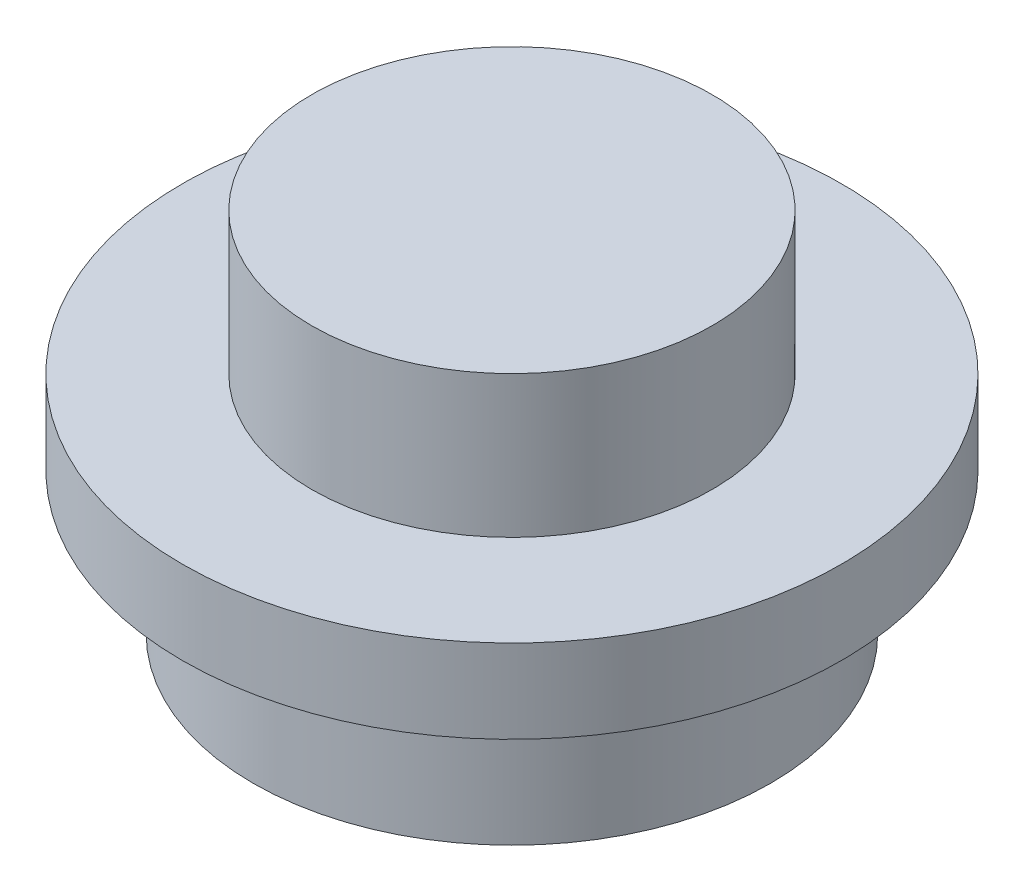
ISO-10303-21;
HEADER;
FILE_DESCRIPTION(('STEP AP214'),'2;1');
FILE_NAME('part.step','',(''),(''),'','','');
FILE_SCHEMA(('AUTOMOTIVE_DESIGN { 1 0 10303 214 1 1 1 1 }'));
ENDSEC;
DATA;
#1=APPLICATION_CONTEXT('core data for automotive mechanical design processes');
#2=APPLICATION_PROTOCOL_DEFINITION('international standard','automotive_design',2000,#1);
#3=PRODUCT_CONTEXT('',#1,'mechanical');
#4=PRODUCT('Part','Part','',(#3));
#5=PRODUCT_RELATED_PRODUCT_CATEGORY('part','',(#4));
#6=PRODUCT_DEFINITION_FORMATION('','',#4);
#7=PRODUCT_DEFINITION_CONTEXT('part definition',#1,'design');
#8=PRODUCT_DEFINITION('design','',#6,#7);
#9=PRODUCT_DEFINITION_SHAPE('','',#8);
#10=(LENGTH_UNIT() NAMED_UNIT(*) SI_UNIT(.MILLI.,.METRE.));
#11=(NAMED_UNIT(*) PLANE_ANGLE_UNIT() SI_UNIT($,.RADIAN.));
#12=(NAMED_UNIT(*) SI_UNIT($,.STERADIAN.) SOLID_ANGLE_UNIT());
#13=UNCERTAINTY_MEASURE_WITH_UNIT(LENGTH_MEASURE(1.E-05),#10,'distance_accuracy_value','');
#14=(GEOMETRIC_REPRESENTATION_CONTEXT(3) GLOBAL_UNCERTAINTY_ASSIGNED_CONTEXT((#13)) GLOBAL_UNIT_ASSIGNED_CONTEXT((#10,
#11,#12)) REPRESENTATION_CONTEXT('',''));
#15=CARTESIAN_POINT('',(0.,0.,0.));
#16=DIRECTION('',(0.,0.,1.));
#17=DIRECTION('',(1.,0.,0.));
#18=AXIS2_PLACEMENT_3D('',#15,#16,#17);
#19=CARTESIAN_POINT('',(0.,0.,0.));
#20=DIRECTION('',(0.,1.,0.));
#21=DIRECTION('',(0.,0.,1.));
#22=AXIS2_PLACEMENT_3D('',#19,#20,#21);
#23=PLANE('',#22);
#24=CARTESIAN_POINT('',(0.,0.,0.));
#25=DIRECTION('',(0.,1.,0.));
#26=DIRECTION('',(0.,0.,1.));
#27=AXIS2_PLACEMENT_3D('',#24,#25,#26);
#28=CIRCLE('',#27,3.1);
#29=CARTESIAN_POINT('',(0.,0.,3.1));
#30=VERTEX_POINT('',#29);
#31=EDGE_CURVE('E34',#30,#30,#28,.T.);
#32=ORIENTED_EDGE('',*,*,#31,.F.);
#33=EDGE_LOOP('',(#32));
#34=FACE_BOUND('',#33,.T.);
#35=CARTESIAN_POINT('',(0.,0.,0.));
#36=DIRECTION('',(0.,1.,0.));
#37=DIRECTION('',(0.,0.,1.));
#38=AXIS2_PLACEMENT_3D('',#35,#36,#37);
#39=CIRCLE('',#38,2.4);
#40=CARTESIAN_POINT('',(0.,0.,2.4));
#41=VERTEX_POINT('',#40);
#42=EDGE_CURVE('E55',#41,#41,#39,.T.);
#43=ORIENTED_EDGE('',*,*,#42,.T.);
#44=EDGE_LOOP('',(#43));
#45=FACE_BOUND('',#44,.T.);
#46=ADVANCED_FACE('F30',(#34,#45),#23,.F.);
#47=CARTESIAN_POINT('',(0.,1.7,0.));
#48=DIRECTION('',(0.,-1.,0.));
#49=DIRECTION('',(0.,0.,-1.));
#50=AXIS2_PLACEMENT_3D('',#47,#48,#49);
#51=CYLINDRICAL_SURFACE('',#50,3.1);
#52=CARTESIAN_POINT('',(0.,1.7,0.));
#53=DIRECTION('',(0.,1.,0.));
#54=DIRECTION('',(0.,0.,1.));
#55=AXIS2_PLACEMENT_3D('',#52,#53,#54);
#56=CIRCLE('',#55,3.1);
#57=CARTESIAN_POINT('',(0.,1.7,3.1));
#58=VERTEX_POINT('',#57);
#59=EDGE_CURVE('E38',#58,#58,#56,.T.);
#60=ORIENTED_EDGE('',*,*,#59,.F.);
#61=EDGE_LOOP('',(#60));
#62=FACE_BOUND('',#61,.T.);
#63=ORIENTED_EDGE('',*,*,#31,.T.);
#64=EDGE_LOOP('',(#63));
#65=FACE_BOUND('',#64,.T.);
#66=ADVANCED_FACE('F32',(#62,#65),#51,.T.);
#67=CARTESIAN_POINT('',(0.,1.7,0.));
#68=DIRECTION('',(0.,-1.,0.));
#69=DIRECTION('',(0.,0.,-1.));
#70=AXIS2_PLACEMENT_3D('',#67,#68,#69);
#71=CYLINDRICAL_SURFACE('',#70,2.4);
#72=CARTESIAN_POINT('',(0.,1.7,0.));
#73=DIRECTION('',(0.,1.,0.));
#74=DIRECTION('',(0.,0.,1.));
#75=AXIS2_PLACEMENT_3D('',#72,#73,#74);
#76=CIRCLE('',#75,2.4);
#77=CARTESIAN_POINT('',(0.,1.7,2.4));
#78=VERTEX_POINT('',#77);
#79=EDGE_CURVE('E49',#78,#78,#76,.T.);
#80=ORIENTED_EDGE('',*,*,#79,.T.);
#81=EDGE_LOOP('',(#80));
#82=FACE_BOUND('',#81,.T.);
#83=ORIENTED_EDGE('',*,*,#42,.F.);
#84=EDGE_LOOP('',(#83));
#85=FACE_BOUND('',#84,.T.);
#86=ADVANCED_FACE('F67',(#82,#85),#71,.F.);
#87=CARTESIAN_POINT('',(0.,1.7,0.));
#88=DIRECTION('',(0.,1.,0.));
#89=DIRECTION('',(0.,0.,1.));
#90=AXIS2_PLACEMENT_3D('',#87,#88,#89);
#91=PLANE('',#90);
#92=ORIENTED_EDGE('',*,*,#79,.F.);
#93=EDGE_LOOP('',(#92));
#94=FACE_BOUND('',#93,.T.);
#95=ADVANCED_FACE('F72',(#94),#91,.F.);
#96=CARTESIAN_POINT('',(0.,2.7,0.));
#97=DIRECTION('',(0.,-1.,0.));
#98=DIRECTION('',(0.,0.,-1.));
#99=AXIS2_PLACEMENT_3D('',#96,#97,#98);
#100=CYLINDRICAL_SURFACE('',#99,3.95);
#101=CARTESIAN_POINT('',(0.,2.7,0.));
#102=DIRECTION('',(0.,1.,0.));
#103=DIRECTION('',(0.,0.,1.));
#104=AXIS2_PLACEMENT_3D('',#101,#102,#103);
#105=CIRCLE('',#104,3.95);
#106=CARTESIAN_POINT('',(0.,2.7,3.95));
#107=VERTEX_POINT('',#106);
#108=EDGE_CURVE('E46',#107,#107,#105,.T.);
#109=ORIENTED_EDGE('',*,*,#108,.F.);
#110=EDGE_LOOP('',(#109));
#111=FACE_BOUND('',#110,.T.);
#112=CARTESIAN_POINT('',(0.,1.7,0.));
#113=DIRECTION('',(0.,1.,0.));
#114=DIRECTION('',(0.,0.,1.));
#115=AXIS2_PLACEMENT_3D('',#112,#113,#114);
#116=CIRCLE('',#115,3.95);
#117=CARTESIAN_POINT('',(0.,1.7,3.95));
#118=VERTEX_POINT('',#117);
#119=EDGE_CURVE('E50',#118,#118,#116,.T.);
#120=ORIENTED_EDGE('',*,*,#119,.T.);
#121=EDGE_LOOP('',(#120));
#122=FACE_BOUND('',#121,.T.);
#123=ADVANCED_FACE('F74',(#111,#122),#100,.T.);
#124=CARTESIAN_POINT('',(0.,2.7,0.));
#125=DIRECTION('',(0.,1.,0.));
#126=DIRECTION('',(0.,0.,1.));
#127=AXIS2_PLACEMENT_3D('',#124,#125,#126);
#128=PLANE('',#127);
#129=CARTESIAN_POINT('',(0.,2.7,0.));
#130=DIRECTION('',(0.,1.,0.));
#131=DIRECTION('',(0.,0.,1.));
#132=AXIS2_PLACEMENT_3D('',#129,#130,#131);
#133=CIRCLE('',#132,2.4);
#134=CARTESIAN_POINT('',(0.,2.7,2.4));
#135=VERTEX_POINT('',#134);
#136=EDGE_CURVE('E10',#135,#135,#133,.T.);
#137=ORIENTED_EDGE('',*,*,#136,.F.);
#138=EDGE_LOOP('',(#137));
#139=FACE_BOUND('',#138,.T.);
#140=ORIENTED_EDGE('',*,*,#108,.T.);
#141=EDGE_LOOP('',(#140));
#142=FACE_BOUND('',#141,.T.);
#143=ADVANCED_FACE('F77',(#139,#142),#128,.T.);
#144=ORIENTED_EDGE('',*,*,#59,.T.);
#145=EDGE_LOOP('',(#144));
#146=FACE_BOUND('',#145,.T.);
#147=ORIENTED_EDGE('',*,*,#119,.F.);
#148=EDGE_LOOP('',(#147));
#149=FACE_BOUND('',#148,.T.);
#150=ADVANCED_FACE('F79',(#146,#149),#91,.F.);
#151=CARTESIAN_POINT('',(0.,4.4,0.));
#152=DIRECTION('',(0.,-1.,0.));
#153=DIRECTION('',(0.,0.,-1.));
#154=AXIS2_PLACEMENT_3D('',#151,#152,#153);
#155=CYLINDRICAL_SURFACE('',#154,2.4);
#156=CARTESIAN_POINT('',(0.,4.4,0.));
#157=DIRECTION('',(0.,1.,0.));
#158=DIRECTION('',(0.,0.,1.));
#159=AXIS2_PLACEMENT_3D('',#156,#157,#158);
#160=CIRCLE('',#159,2.4);
#161=CARTESIAN_POINT('',(0.,4.4,2.4));
#162=VERTEX_POINT('',#161);
#163=EDGE_CURVE('E45',#162,#162,#160,.T.);
#164=ORIENTED_EDGE('',*,*,#163,.F.);
#165=EDGE_LOOP('',(#164));
#166=FACE_BOUND('',#165,.T.);
#167=ORIENTED_EDGE('',*,*,#136,.T.);
#168=EDGE_LOOP('',(#167));
#169=FACE_BOUND('',#168,.T.);
#170=ADVANCED_FACE('F82',(#166,#169),#155,.T.);
#171=CARTESIAN_POINT('',(0.,4.4,0.));
#172=DIRECTION('',(0.,1.,0.));
#173=DIRECTION('',(0.,0.,1.));
#174=AXIS2_PLACEMENT_3D('',#171,#172,#173);
#175=PLANE('',#174);
#176=ORIENTED_EDGE('',*,*,#163,.T.);
#177=EDGE_LOOP('',(#176));
#178=FACE_BOUND('',#177,.T.);
#179=ADVANCED_FACE('F89',(#178),#175,.T.);
#180=CLOSED_SHELL('',(#46,#66,#86,#95,#123,#143,#150,#170,#179));
#181=MANIFOLD_SOLID_BREP('B2',#180);
#182=ADVANCED_BREP_SHAPE_REPRESENTATION('',(#18,#181),#14);
#183=SHAPE_DEFINITION_REPRESENTATION(#9,#182);
ENDSEC;
END-ISO-10303-21;
